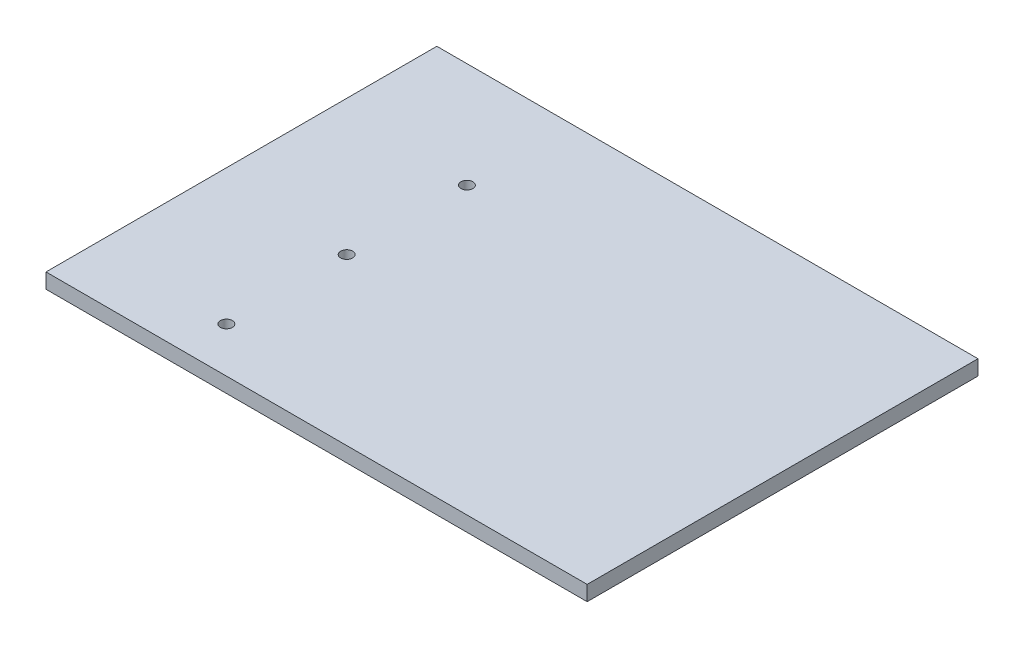
ISO-10303-21;
HEADER;
FILE_DESCRIPTION(('STEP AP214'),'2;1');
FILE_NAME('part.step','',(''),(''),'','','');
FILE_SCHEMA(('AUTOMOTIVE_DESIGN { 1 0 10303 214 1 1 1 1 }'));
ENDSEC;
DATA;
#1=APPLICATION_CONTEXT('core data for automotive mechanical design processes');
#2=APPLICATION_PROTOCOL_DEFINITION('international standard','automotive_design',2000,#1);
#3=PRODUCT_CONTEXT('',#1,'mechanical');
#4=PRODUCT('Part','Part','',(#3));
#5=PRODUCT_RELATED_PRODUCT_CATEGORY('part','',(#4));
#6=PRODUCT_DEFINITION_FORMATION('','',#4);
#7=PRODUCT_DEFINITION_CONTEXT('part definition',#1,'design');
#8=PRODUCT_DEFINITION('design','',#6,#7);
#9=PRODUCT_DEFINITION_SHAPE('','',#8);
#10=(LENGTH_UNIT() NAMED_UNIT(*) SI_UNIT(.MILLI.,.METRE.));
#11=(NAMED_UNIT(*) PLANE_ANGLE_UNIT() SI_UNIT($,.RADIAN.));
#12=(NAMED_UNIT(*) SI_UNIT($,.STERADIAN.) SOLID_ANGLE_UNIT());
#13=UNCERTAINTY_MEASURE_WITH_UNIT(LENGTH_MEASURE(1.E-05),#10,'distance_accuracy_value','');
#14=(GEOMETRIC_REPRESENTATION_CONTEXT(3) GLOBAL_UNCERTAINTY_ASSIGNED_CONTEXT((#13)) GLOBAL_UNIT_ASSIGNED_CONTEXT((#10,
#11,#12)) REPRESENTATION_CONTEXT('',''));
#15=CARTESIAN_POINT('',(0.,0.,0.));
#16=DIRECTION('',(0.,0.,1.));
#17=DIRECTION('',(1.,0.,0.));
#18=AXIS2_PLACEMENT_3D('',#15,#16,#17);
#19=CARTESIAN_POINT('',(-228.6,12.7,-165.1));
#20=DIRECTION('',(1.,0.,0.));
#21=DIRECTION('',(0.,0.,-1.));
#22=AXIS2_PLACEMENT_3D('',#19,#20,#21);
#23=PLANE('',#22);
#24=DIRECTION('',(0.,0.,1.));
#25=VECTOR('',#24,1.);
#26=CARTESIAN_POINT('',(-228.6,0.,-165.1));
#27=LINE('',#26,#25);
#28=CARTESIAN_POINT('',(-228.6,0.,-165.1));
#29=VERTEX_POINT('',#28);
#30=CARTESIAN_POINT('',(-228.6,0.,165.1));
#31=VERTEX_POINT('',#30);
#32=EDGE_CURVE('E98',#29,#31,#27,.T.);
#33=ORIENTED_EDGE('',*,*,#32,.T.);
#34=DIRECTION('',(0.,-1.,0.));
#35=VECTOR('',#34,1.);
#36=CARTESIAN_POINT('',(-228.6,12.7,165.1));
#37=LINE('',#36,#35);
#38=CARTESIAN_POINT('',(-228.6,12.7,165.1));
#39=VERTEX_POINT('',#38);
#40=EDGE_CURVE('E11',#39,#31,#37,.T.);
#41=ORIENTED_EDGE('',*,*,#40,.F.);
#42=DIRECTION('',(0.,0.,1.));
#43=VECTOR('',#42,1.);
#44=CARTESIAN_POINT('',(-228.6,12.7,-165.1));
#45=LINE('',#44,#43);
#46=CARTESIAN_POINT('',(-228.6,12.7,-165.1));
#47=VERTEX_POINT('',#46);
#48=EDGE_CURVE('E86',#47,#39,#45,.T.);
#49=ORIENTED_EDGE('',*,*,#48,.F.);
#50=DIRECTION('',(0.,-1.,0.));
#51=VECTOR('',#50,1.);
#52=CARTESIAN_POINT('',(-228.6,12.7,-165.1));
#53=LINE('',#52,#51);
#54=EDGE_CURVE('E94',#47,#29,#53,.T.);
#55=ORIENTED_EDGE('',*,*,#54,.T.);
#56=EDGE_LOOP('',(#33,#41,#49,#55));
#57=FACE_BOUND('',#56,.T.);
#58=ADVANCED_FACE('F35',(#57),#23,.F.);
#59=CARTESIAN_POINT('',(-228.6,12.7,165.1));
#60=DIRECTION('',(0.,0.,-1.));
#61=DIRECTION('',(-1.,0.,0.));
#62=AXIS2_PLACEMENT_3D('',#59,#60,#61);
#63=PLANE('',#62);
#64=DIRECTION('',(1.,0.,0.));
#65=VECTOR('',#64,1.);
#66=CARTESIAN_POINT('',(-228.6,0.,165.1));
#67=LINE('',#66,#65);
#68=CARTESIAN_POINT('',(228.6,0.,165.1));
#69=VERTEX_POINT('',#68);
#70=EDGE_CURVE('E90',#31,#69,#67,.T.);
#71=ORIENTED_EDGE('',*,*,#70,.T.);
#72=DIRECTION('',(0.,-1.,0.));
#73=VECTOR('',#72,1.);
#74=CARTESIAN_POINT('',(228.6,12.7,165.1));
#75=LINE('',#74,#73);
#76=CARTESIAN_POINT('',(228.6,12.7,165.1));
#77=VERTEX_POINT('',#76);
#78=EDGE_CURVE('E43',#77,#69,#75,.T.);
#79=ORIENTED_EDGE('',*,*,#78,.F.);
#80=DIRECTION('',(1.,0.,0.));
#81=VECTOR('',#80,1.);
#82=CARTESIAN_POINT('',(-228.6,12.7,165.1));
#83=LINE('',#82,#81);
#84=EDGE_CURVE('E81',#39,#77,#83,.T.);
#85=ORIENTED_EDGE('',*,*,#84,.F.);
#86=ORIENTED_EDGE('',*,*,#40,.T.);
#87=EDGE_LOOP('',(#71,#79,#85,#86));
#88=FACE_BOUND('',#87,.T.);
#89=ADVANCED_FACE('F89',(#88),#63,.F.);
#90=CARTESIAN_POINT('',(228.6,12.7,-165.1));
#91=DIRECTION('',(-1.,0.,0.));
#92=DIRECTION('',(0.,0.,1.));
#93=AXIS2_PLACEMENT_3D('',#90,#91,#92);
#94=PLANE('',#93);
#95=DIRECTION('',(0.,0.,-1.));
#96=VECTOR('',#95,1.);
#97=CARTESIAN_POINT('',(228.6,0.,-165.1));
#98=LINE('',#97,#96);
#99=CARTESIAN_POINT('',(228.6,0.,-165.1));
#100=VERTEX_POINT('',#99);
#101=EDGE_CURVE('E68',#69,#100,#98,.T.);
#102=ORIENTED_EDGE('',*,*,#101,.T.);
#103=DIRECTION('',(0.,-1.,0.));
#104=VECTOR('',#103,1.);
#105=CARTESIAN_POINT('',(228.6,12.7,-165.1));
#106=LINE('',#105,#104);
#107=CARTESIAN_POINT('',(228.6,12.7,-165.1));
#108=VERTEX_POINT('',#107);
#109=EDGE_CURVE('E91',#108,#100,#106,.T.);
#110=ORIENTED_EDGE('',*,*,#109,.F.);
#111=DIRECTION('',(0.,0.,-1.));
#112=VECTOR('',#111,1.);
#113=CARTESIAN_POINT('',(228.6,12.7,-165.1));
#114=LINE('',#113,#112);
#115=EDGE_CURVE('E84',#77,#108,#114,.T.);
#116=ORIENTED_EDGE('',*,*,#115,.F.);
#117=ORIENTED_EDGE('',*,*,#78,.T.);
#118=EDGE_LOOP('',(#102,#110,#116,#117));
#119=FACE_BOUND('',#118,.T.);
#120=ADVANCED_FACE('F92',(#119),#94,.F.);
#121=CARTESIAN_POINT('',(-228.6,12.7,-165.1));
#122=DIRECTION('',(0.,0.,1.));
#123=DIRECTION('',(1.,0.,0.));
#124=AXIS2_PLACEMENT_3D('',#121,#122,#123);
#125=PLANE('',#124);
#126=DIRECTION('',(-1.,0.,0.));
#127=VECTOR('',#126,1.);
#128=CARTESIAN_POINT('',(-228.6,0.,-165.1));
#129=LINE('',#128,#127);
#130=EDGE_CURVE('E74',#100,#29,#129,.T.);
#131=ORIENTED_EDGE('',*,*,#130,.T.);
#132=ORIENTED_EDGE('',*,*,#54,.F.);
#133=DIRECTION('',(-1.,0.,0.));
#134=VECTOR('',#133,1.);
#135=CARTESIAN_POINT('',(-228.6,12.7,-165.1));
#136=LINE('',#135,#134);
#137=EDGE_CURVE('E51',#108,#47,#136,.T.);
#138=ORIENTED_EDGE('',*,*,#137,.F.);
#139=ORIENTED_EDGE('',*,*,#109,.T.);
#140=EDGE_LOOP('',(#131,#132,#138,#139));
#141=FACE_BOUND('',#140,.T.);
#142=ADVANCED_FACE('F106',(#141),#125,.F.);
#143=CARTESIAN_POINT('',(0.,12.7,0.));
#144=DIRECTION('',(0.,1.,0.));
#145=DIRECTION('',(0.,0.,1.));
#146=AXIS2_PLACEMENT_3D('',#143,#144,#145);
#147=PLANE('',#146);
#148=CARTESIAN_POINT('',(-114.30000000293,12.7,-76.1999999999999));
#149=DIRECTION('',(0.,1.,0.));
#150=DIRECTION('',(0.,0.,1.));
#151=AXIS2_PLACEMENT_3D('',#148,#149,#150);
#152=CIRCLE('',#151,5.04189999999999);
#153=CARTESIAN_POINT('',(-114.30000000293,12.7,-71.1580999999999));
#154=VERTEX_POINT('',#153);
#155=EDGE_CURVE('E126',#154,#154,#152,.T.);
#156=ORIENTED_EDGE('',*,*,#155,.F.);
#157=EDGE_LOOP('',(#156));
#158=FACE_BOUND('',#157,.T.);
#159=CARTESIAN_POINT('',(-114.30000000293,12.7,25.4000000000001));
#160=DIRECTION('',(0.,1.,0.));
#161=DIRECTION('',(0.,0.,1.));
#162=AXIS2_PLACEMENT_3D('',#159,#160,#161);
#163=CIRCLE('',#162,5.04189999999999);
#164=CARTESIAN_POINT('',(-114.30000000293,12.7,30.4419000000001));
#165=VERTEX_POINT('',#164);
#166=EDGE_CURVE('E120',#165,#165,#163,.T.);
#167=ORIENTED_EDGE('',*,*,#166,.F.);
#168=EDGE_LOOP('',(#167));
#169=FACE_BOUND('',#168,.T.);
#170=CARTESIAN_POINT('',(-114.30000000293,12.7,127.));
#171=DIRECTION('',(0.,1.,0.));
#172=DIRECTION('',(0.,0.,1.));
#173=AXIS2_PLACEMENT_3D('',#170,#171,#172);
#174=CIRCLE('',#173,5.04189999999999);
#175=CARTESIAN_POINT('',(-114.30000000293,12.7,132.0419));
#176=VERTEX_POINT('',#175);
#177=EDGE_CURVE('E114',#176,#176,#174,.T.);
#178=ORIENTED_EDGE('',*,*,#177,.F.);
#179=EDGE_LOOP('',(#178));
#180=FACE_BOUND('',#179,.T.);
#181=ORIENTED_EDGE('',*,*,#48,.T.);
#182=ORIENTED_EDGE('',*,*,#84,.T.);
#183=ORIENTED_EDGE('',*,*,#115,.T.);
#184=ORIENTED_EDGE('',*,*,#137,.T.);
#185=EDGE_LOOP('',(#181,#182,#183,#184));
#186=FACE_BOUND('',#185,.T.);
#187=ADVANCED_FACE('F82',(#158,#169,#180,#186),#147,.T.);
#188=CARTESIAN_POINT('',(0.,0.,0.));
#189=DIRECTION('',(0.,1.,0.));
#190=DIRECTION('',(0.,0.,1.));
#191=AXIS2_PLACEMENT_3D('',#188,#189,#190);
#192=PLANE('',#191);
#193=CARTESIAN_POINT('',(-114.30000000293,0.,-76.1999999999999));
#194=DIRECTION('',(0.,1.,0.));
#195=DIRECTION('',(0.,0.,1.));
#196=AXIS2_PLACEMENT_3D('',#193,#194,#195);
#197=CIRCLE('',#196,5.04189999999999);
#198=CARTESIAN_POINT('',(-114.30000000293,0.,-71.1580999999999));
#199=VERTEX_POINT('',#198);
#200=EDGE_CURVE('E123',#199,#199,#197,.T.);
#201=ORIENTED_EDGE('',*,*,#200,.T.);
#202=EDGE_LOOP('',(#201));
#203=FACE_BOUND('',#202,.T.);
#204=CARTESIAN_POINT('',(-114.30000000293,0.,25.4000000000001));
#205=DIRECTION('',(0.,1.,0.));
#206=DIRECTION('',(0.,0.,1.));
#207=AXIS2_PLACEMENT_3D('',#204,#205,#206);
#208=CIRCLE('',#207,5.04189999999999);
#209=CARTESIAN_POINT('',(-114.30000000293,0.,30.4419000000001));
#210=VERTEX_POINT('',#209);
#211=EDGE_CURVE('E117',#210,#210,#208,.T.);
#212=ORIENTED_EDGE('',*,*,#211,.T.);
#213=EDGE_LOOP('',(#212));
#214=FACE_BOUND('',#213,.T.);
#215=CARTESIAN_POINT('',(-114.30000000293,0.,127.));
#216=DIRECTION('',(0.,1.,0.));
#217=DIRECTION('',(0.,0.,1.));
#218=AXIS2_PLACEMENT_3D('',#215,#216,#217);
#219=CIRCLE('',#218,5.04189999999999);
#220=CARTESIAN_POINT('',(-114.30000000293,0.,132.0419));
#221=VERTEX_POINT('',#220);
#222=EDGE_CURVE('E101',#221,#221,#219,.T.);
#223=ORIENTED_EDGE('',*,*,#222,.T.);
#224=EDGE_LOOP('',(#223));
#225=FACE_BOUND('',#224,.T.);
#226=ORIENTED_EDGE('',*,*,#32,.F.);
#227=ORIENTED_EDGE('',*,*,#130,.F.);
#228=ORIENTED_EDGE('',*,*,#101,.F.);
#229=ORIENTED_EDGE('',*,*,#70,.F.);
#230=EDGE_LOOP('',(#226,#227,#228,#229));
#231=FACE_BOUND('',#230,.T.);
#232=ADVANCED_FACE('F109',(#203,#214,#225,#231),#192,.F.);
#233=CARTESIAN_POINT('',(-114.30000000293,12.7,127.));
#234=DIRECTION('',(0.,1.,0.));
#235=DIRECTION('',(0.,0.,1.));
#236=AXIS2_PLACEMENT_3D('',#233,#234,#235);
#237=CYLINDRICAL_SURFACE('',#236,5.04189999999999);
#238=ORIENTED_EDGE('',*,*,#222,.F.);
#239=EDGE_LOOP('',(#238));
#240=FACE_BOUND('',#239,.T.);
#241=ORIENTED_EDGE('',*,*,#177,.T.);
#242=EDGE_LOOP('',(#241));
#243=FACE_BOUND('',#242,.T.);
#244=ADVANCED_FACE('F139',(#240,#243),#237,.F.);
#245=CARTESIAN_POINT('',(-114.30000000293,12.7,25.4000000000001));
#246=DIRECTION('',(0.,1.,0.));
#247=DIRECTION('',(0.,0.,1.));
#248=AXIS2_PLACEMENT_3D('',#245,#246,#247);
#249=CYLINDRICAL_SURFACE('',#248,5.04189999999999);
#250=ORIENTED_EDGE('',*,*,#211,.F.);
#251=EDGE_LOOP('',(#250));
#252=FACE_BOUND('',#251,.T.);
#253=ORIENTED_EDGE('',*,*,#166,.T.);
#254=EDGE_LOOP('',(#253));
#255=FACE_BOUND('',#254,.T.);
#256=ADVANCED_FACE('F141',(#252,#255),#249,.F.);
#257=CARTESIAN_POINT('',(-114.30000000293,12.7,-76.1999999999999));
#258=DIRECTION('',(0.,1.,0.));
#259=DIRECTION('',(0.,0.,1.));
#260=AXIS2_PLACEMENT_3D('',#257,#258,#259);
#261=CYLINDRICAL_SURFACE('',#260,5.04189999999999);
#262=ORIENTED_EDGE('',*,*,#200,.F.);
#263=EDGE_LOOP('',(#262));
#264=FACE_BOUND('',#263,.T.);
#265=ORIENTED_EDGE('',*,*,#155,.T.);
#266=EDGE_LOOP('',(#265));
#267=FACE_BOUND('',#266,.T.);
#268=ADVANCED_FACE('F130',(#264,#267),#261,.F.);
#269=CLOSED_SHELL('',(#58,#89,#120,#142,#187,#232,#244,#256,#268));
#270=MANIFOLD_SOLID_BREP('B2',#269);
#271=ADVANCED_BREP_SHAPE_REPRESENTATION('',(#18,#270),#14);
#272=SHAPE_DEFINITION_REPRESENTATION(#9,#271);
ENDSEC;
END-ISO-10303-21;
